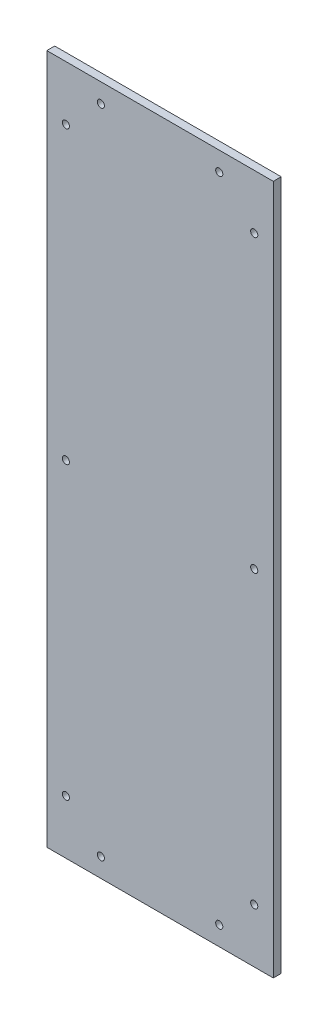
ISO-10303-21;
HEADER;
FILE_DESCRIPTION(('STEP AP214'),'2;1');
FILE_NAME('part.step','',(''),(''),'','','');
FILE_SCHEMA(('AUTOMOTIVE_DESIGN { 1 0 10303 214 1 1 1 1 }'));
ENDSEC;
DATA;
#1=APPLICATION_CONTEXT('core data for automotive mechanical design processes');
#2=APPLICATION_PROTOCOL_DEFINITION('international standard','automotive_design',2000,#1);
#3=PRODUCT_CONTEXT('',#1,'mechanical');
#4=PRODUCT('Part','Part','',(#3));
#5=PRODUCT_RELATED_PRODUCT_CATEGORY('part','',(#4));
#6=PRODUCT_DEFINITION_FORMATION('','',#4);
#7=PRODUCT_DEFINITION_CONTEXT('part definition',#1,'design');
#8=PRODUCT_DEFINITION('design','',#6,#7);
#9=PRODUCT_DEFINITION_SHAPE('','',#8);
#10=(LENGTH_UNIT() NAMED_UNIT(*) SI_UNIT(.MILLI.,.METRE.));
#11=(NAMED_UNIT(*) PLANE_ANGLE_UNIT() SI_UNIT($,.RADIAN.));
#12=(NAMED_UNIT(*) SI_UNIT($,.STERADIAN.) SOLID_ANGLE_UNIT());
#13=UNCERTAINTY_MEASURE_WITH_UNIT(LENGTH_MEASURE(1.E-05),#10,'distance_accuracy_value','');
#14=(GEOMETRIC_REPRESENTATION_CONTEXT(3) GLOBAL_UNCERTAINTY_ASSIGNED_CONTEXT((#13)) GLOBAL_UNIT_ASSIGNED_CONTEXT((#10,
#11,#12)) REPRESENTATION_CONTEXT('',''));
#15=CARTESIAN_POINT('',(0.,0.,0.));
#16=DIRECTION('',(0.,0.,1.));
#17=DIRECTION('',(1.,0.,0.));
#18=AXIS2_PLACEMENT_3D('',#15,#16,#17);
#19=CARTESIAN_POINT('',(0.,0.,4.7625));
#20=DIRECTION('',(0.,0.,1.));
#21=DIRECTION('',(1.,0.,0.));
#22=AXIS2_PLACEMENT_3D('',#19,#20,#21);
#23=PLANE('',#22);
#24=CARTESIAN_POINT('',(-92.2409193612177,-195.918834656084,4.7625));
#25=DIRECTION('',(0.,0.,-1.));
#26=DIRECTION('',(-1.,0.,0.));
#27=AXIS2_PLACEMENT_3D('',#24,#25,#26);
#28=CIRCLE('',#27,2.15265000000001);
#29=CARTESIAN_POINT('',(-94.3935693612177,-195.918834656084,4.7625));
#30=VERTEX_POINT('',#29);
#31=EDGE_CURVE('E165',#30,#30,#28,.T.);
#32=ORIENTED_EDGE('',*,*,#31,.T.);
#33=EDGE_LOOP('',(#32));
#34=FACE_BOUND('',#33,.T.);
#35=DIRECTION('',(0.,-1.,0.));
#36=VECTOR('',#35,1.);
#37=CARTESIAN_POINT('',(-124.816419361218,208.512665343915,4.7625));
#38=LINE('',#37,#36);
#39=CARTESIAN_POINT('',(-124.816419361218,208.512665343915,4.7625));
#40=VERTEX_POINT('',#39);
#41=CARTESIAN_POINT('',(-124.816419361218,-207.412334656085,4.7625));
#42=VERTEX_POINT('',#41);
#43=EDGE_CURVE('E86',#40,#42,#38,.T.);
#44=ORIENTED_EDGE('',*,*,#43,.T.);
#45=DIRECTION('',(1.,0.,0.));
#46=VECTOR('',#45,1.);
#47=CARTESIAN_POINT('',(-124.816419361218,-207.412334656085,4.7625));
#48=LINE('',#47,#46);
#49=CARTESIAN_POINT('',(11.7085806387823,-207.412334656085,4.7625));
#50=VERTEX_POINT('',#49);
#51=EDGE_CURVE('E81',#42,#50,#48,.T.);
#52=ORIENTED_EDGE('',*,*,#51,.T.);
#53=DIRECTION('',(0.,1.,0.));
#54=VECTOR('',#53,1.);
#55=CARTESIAN_POINT('',(11.7085806387823,208.512665343915,4.7625));
#56=LINE('',#55,#54);
#57=CARTESIAN_POINT('',(11.7085806387823,208.512665343915,4.7625));
#58=VERTEX_POINT('',#57);
#59=EDGE_CURVE('E84',#50,#58,#56,.T.);
#60=ORIENTED_EDGE('',*,*,#59,.T.);
#61=DIRECTION('',(-1.,0.,0.));
#62=VECTOR('',#61,1.);
#63=CARTESIAN_POINT('',(-124.816419361218,208.512665343915,4.7625));
#64=LINE('',#63,#62);
#65=EDGE_CURVE('E51',#58,#40,#64,.T.);
#66=ORIENTED_EDGE('',*,*,#65,.T.);
#67=EDGE_LOOP('',(#44,#52,#60,#66));
#68=FACE_BOUND('',#67,.T.);
#69=CARTESIAN_POINT('',(0.215080638782242,175.683165343915,4.7625));
#70=DIRECTION('',(0.,0.,-1.));
#71=DIRECTION('',(-1.,0.,0.));
#72=AXIS2_PLACEMENT_3D('',#69,#70,#71);
#73=CIRCLE('',#72,2.15265);
#74=CARTESIAN_POINT('',(-1.93756936121776,175.683165343915,4.7625));
#75=VERTEX_POINT('',#74);
#76=EDGE_CURVE('E101',#75,#75,#73,.T.);
#77=ORIENTED_EDGE('',*,*,#76,.T.);
#78=EDGE_LOOP('',(#77));
#79=FACE_BOUND('',#78,.T.);
#80=CARTESIAN_POINT('',(-113.322919361218,175.683165343915,4.7625));
#81=DIRECTION('',(0.,0.,-1.));
#82=DIRECTION('',(-1.,0.,0.));
#83=AXIS2_PLACEMENT_3D('',#80,#81,#82);
#84=CIRCLE('',#83,2.15265000000001);
#85=CARTESIAN_POINT('',(-115.475569361218,175.683165343915,4.7625));
#86=VERTEX_POINT('',#85);
#87=EDGE_CURVE('E117',#86,#86,#84,.T.);
#88=ORIENTED_EDGE('',*,*,#87,.T.);
#89=EDGE_LOOP('',(#88));
#90=FACE_BOUND('',#89,.T.);
#91=CARTESIAN_POINT('',(0.215080638782265,0.423165343915571,4.7625));
#92=DIRECTION('',(0.,0.,-1.));
#93=DIRECTION('',(-1.,0.,0.));
#94=AXIS2_PLACEMENT_3D('',#91,#92,#93);
#95=CIRCLE('',#94,2.15265);
#96=CARTESIAN_POINT('',(-1.93756936121773,0.423165343915571,4.7625));
#97=VERTEX_POINT('',#96);
#98=EDGE_CURVE('E123',#97,#97,#95,.T.);
#99=ORIENTED_EDGE('',*,*,#98,.T.);
#100=EDGE_LOOP('',(#99));
#101=FACE_BOUND('',#100,.T.);
#102=CARTESIAN_POINT('',(-20.8669193612177,197.019165343915,4.7625));
#103=DIRECTION('',(0.,0.,-1.));
#104=DIRECTION('',(-1.,0.,0.));
#105=AXIS2_PLACEMENT_3D('',#102,#103,#104);
#106=CIRCLE('',#105,2.15265);
#107=CARTESIAN_POINT('',(-23.0195693612177,197.019165343915,4.7625));
#108=VERTEX_POINT('',#107);
#109=EDGE_CURVE('E129',#108,#108,#106,.T.);
#110=ORIENTED_EDGE('',*,*,#109,.T.);
#111=EDGE_LOOP('',(#110));
#112=FACE_BOUND('',#111,.T.);
#113=CARTESIAN_POINT('',(-92.2409193612177,197.019165343915,4.7625));
#114=DIRECTION('',(0.,0.,-1.));
#115=DIRECTION('',(-1.,0.,0.));
#116=AXIS2_PLACEMENT_3D('',#113,#114,#115);
#117=CIRCLE('',#116,2.15265000000001);
#118=CARTESIAN_POINT('',(-94.3935693612177,197.019165343915,4.7625));
#119=VERTEX_POINT('',#118);
#120=EDGE_CURVE('E135',#119,#119,#117,.T.);
#121=ORIENTED_EDGE('',*,*,#120,.T.);
#122=EDGE_LOOP('',(#121));
#123=FACE_BOUND('',#122,.T.);
#124=CARTESIAN_POINT('',(-113.322919361218,0.42316534391551,4.7625));
#125=DIRECTION('',(0.,0.,-1.));
#126=DIRECTION('',(-1.,0.,0.));
#127=AXIS2_PLACEMENT_3D('',#124,#125,#126);
#128=CIRCLE('',#127,2.15265000000001);
#129=CARTESIAN_POINT('',(-115.475569361218,0.42316534391551,4.7625));
#130=VERTEX_POINT('',#129);
#131=EDGE_CURVE('E141',#130,#130,#128,.T.);
#132=ORIENTED_EDGE('',*,*,#131,.T.);
#133=EDGE_LOOP('',(#132));
#134=FACE_BOUND('',#133,.T.);
#135=CARTESIAN_POINT('',(0.215080638782289,-174.836834656084,4.7625));
#136=DIRECTION('',(0.,0.,-1.));
#137=DIRECTION('',(-1.,0.,0.));
#138=AXIS2_PLACEMENT_3D('',#135,#136,#137);
#139=CIRCLE('',#138,2.15265);
#140=CARTESIAN_POINT('',(-1.93756936121771,-174.836834656084,4.7625));
#141=VERTEX_POINT('',#140);
#142=EDGE_CURVE('E147',#141,#141,#139,.T.);
#143=ORIENTED_EDGE('',*,*,#142,.T.);
#144=EDGE_LOOP('',(#143));
#145=FACE_BOUND('',#144,.T.);
#146=CARTESIAN_POINT('',(-20.8669193612177,-195.918834656084,4.7625));
#147=DIRECTION('',(0.,0.,-1.));
#148=DIRECTION('',(-1.,0.,0.));
#149=AXIS2_PLACEMENT_3D('',#146,#147,#148);
#150=CIRCLE('',#149,2.15265);
#151=CARTESIAN_POINT('',(-23.0195693612177,-195.918834656084,4.7625));
#152=VERTEX_POINT('',#151);
#153=EDGE_CURVE('E153',#152,#152,#150,.T.);
#154=ORIENTED_EDGE('',*,*,#153,.T.);
#155=EDGE_LOOP('',(#154));
#156=FACE_BOUND('',#155,.T.);
#157=CARTESIAN_POINT('',(-113.322919361218,-174.836834656084,4.7625));
#158=DIRECTION('',(0.,0.,-1.));
#159=DIRECTION('',(-1.,0.,0.));
#160=AXIS2_PLACEMENT_3D('',#157,#158,#159);
#161=CIRCLE('',#160,2.15265000000001);
#162=CARTESIAN_POINT('',(-115.475569361218,-174.836834656084,4.7625));
#163=VERTEX_POINT('',#162);
#164=EDGE_CURVE('E159',#163,#163,#161,.T.);
#165=ORIENTED_EDGE('',*,*,#164,.T.);
#166=EDGE_LOOP('',(#165));
#167=FACE_BOUND('',#166,.T.);
#168=ADVANCED_FACE('F34',(#34,#68,#79,#90,#101,#112,#123,#134,#145,#156,#167),#23,.T.);
#169=CARTESIAN_POINT('',(-124.816419361218,208.512665343915,4.7625));
#170=DIRECTION('',(1.,0.,0.));
#171=DIRECTION('',(0.,1.,0.));
#172=AXIS2_PLACEMENT_3D('',#169,#170,#171);
#173=PLANE('',#172);
#174=DIRECTION('',(0.,-1.,0.));
#175=VECTOR('',#174,1.);
#176=CARTESIAN_POINT('',(-124.816419361218,208.512665343915,0.));
#177=LINE('',#176,#175);
#178=CARTESIAN_POINT('',(-124.816419361218,208.512665343915,0.));
#179=VERTEX_POINT('',#178);
#180=CARTESIAN_POINT('',(-124.816419361218,-207.412334656085,0.));
#181=VERTEX_POINT('',#180);
#182=EDGE_CURVE('E98',#179,#181,#177,.T.);
#183=ORIENTED_EDGE('',*,*,#182,.T.);
#184=DIRECTION('',(0.,0.,-1.));
#185=VECTOR('',#184,1.);
#186=CARTESIAN_POINT('',(-124.816419361218,-207.412334656085,4.7625));
#187=LINE('',#186,#185);
#188=EDGE_CURVE('E11',#42,#181,#187,.T.);
#189=ORIENTED_EDGE('',*,*,#188,.F.);
#190=ORIENTED_EDGE('',*,*,#43,.F.);
#191=DIRECTION('',(0.,0.,-1.));
#192=VECTOR('',#191,1.);
#193=CARTESIAN_POINT('',(-124.816419361218,208.512665343915,4.7625));
#194=LINE('',#193,#192);
#195=EDGE_CURVE('E94',#40,#179,#194,.T.);
#196=ORIENTED_EDGE('',*,*,#195,.T.);
#197=EDGE_LOOP('',(#183,#189,#190,#196));
#198=FACE_BOUND('',#197,.T.);
#199=ADVANCED_FACE('F36',(#198),#173,.F.);
#200=CARTESIAN_POINT('',(-124.816419361218,-207.412334656085,4.7625));
#201=DIRECTION('',(0.,1.,0.));
#202=DIRECTION('',(0.,0.,1.));
#203=AXIS2_PLACEMENT_3D('',#200,#201,#202);
#204=PLANE('',#203);
#205=DIRECTION('',(1.,0.,0.));
#206=VECTOR('',#205,1.);
#207=CARTESIAN_POINT('',(-124.816419361218,-207.412334656085,0.));
#208=LINE('',#207,#206);
#209=CARTESIAN_POINT('',(11.7085806387823,-207.412334656085,0.));
#210=VERTEX_POINT('',#209);
#211=EDGE_CURVE('E90',#181,#210,#208,.T.);
#212=ORIENTED_EDGE('',*,*,#211,.T.);
#213=DIRECTION('',(0.,0.,-1.));
#214=VECTOR('',#213,1.);
#215=CARTESIAN_POINT('',(11.7085806387823,-207.412334656085,4.7625));
#216=LINE('',#215,#214);
#217=EDGE_CURVE('E43',#50,#210,#216,.T.);
#218=ORIENTED_EDGE('',*,*,#217,.F.);
#219=ORIENTED_EDGE('',*,*,#51,.F.);
#220=ORIENTED_EDGE('',*,*,#188,.T.);
#221=EDGE_LOOP('',(#212,#218,#219,#220));
#222=FACE_BOUND('',#221,.T.);
#223=ADVANCED_FACE('F89',(#222),#204,.F.);
#224=CARTESIAN_POINT('',(11.7085806387823,208.512665343915,4.7625));
#225=DIRECTION('',(-1.,0.,0.));
#226=DIRECTION('',(0.,0.,1.));
#227=AXIS2_PLACEMENT_3D('',#224,#225,#226);
#228=PLANE('',#227);
#229=DIRECTION('',(0.,1.,0.));
#230=VECTOR('',#229,1.);
#231=CARTESIAN_POINT('',(11.7085806387823,208.512665343915,0.));
#232=LINE('',#231,#230);
#233=CARTESIAN_POINT('',(11.7085806387823,208.512665343915,0.));
#234=VERTEX_POINT('',#233);
#235=EDGE_CURVE('E68',#210,#234,#232,.T.);
#236=ORIENTED_EDGE('',*,*,#235,.T.);
#237=DIRECTION('',(0.,0.,-1.));
#238=VECTOR('',#237,1.);
#239=CARTESIAN_POINT('',(11.7085806387823,208.512665343915,4.7625));
#240=LINE('',#239,#238);
#241=EDGE_CURVE('E91',#58,#234,#240,.T.);
#242=ORIENTED_EDGE('',*,*,#241,.F.);
#243=ORIENTED_EDGE('',*,*,#59,.F.);
#244=ORIENTED_EDGE('',*,*,#217,.T.);
#245=EDGE_LOOP('',(#236,#242,#243,#244));
#246=FACE_BOUND('',#245,.T.);
#247=ADVANCED_FACE('F92',(#246),#228,.F.);
#248=CARTESIAN_POINT('',(-124.816419361218,208.512665343915,4.7625));
#249=DIRECTION('',(0.,-1.,0.));
#250=DIRECTION('',(0.,0.,-1.));
#251=AXIS2_PLACEMENT_3D('',#248,#249,#250);
#252=PLANE('',#251);
#253=DIRECTION('',(-1.,0.,0.));
#254=VECTOR('',#253,1.);
#255=CARTESIAN_POINT('',(-124.816419361218,208.512665343915,0.));
#256=LINE('',#255,#254);
#257=EDGE_CURVE('E74',#234,#179,#256,.T.);
#258=ORIENTED_EDGE('',*,*,#257,.T.);
#259=ORIENTED_EDGE('',*,*,#195,.F.);
#260=ORIENTED_EDGE('',*,*,#65,.F.);
#261=ORIENTED_EDGE('',*,*,#241,.T.);
#262=EDGE_LOOP('',(#258,#259,#260,#261));
#263=FACE_BOUND('',#262,.T.);
#264=ADVANCED_FACE('F106',(#263),#252,.F.);
#265=CARTESIAN_POINT('',(0.,0.,0.));
#266=DIRECTION('',(0.,0.,1.));
#267=DIRECTION('',(1.,0.,0.));
#268=AXIS2_PLACEMENT_3D('',#265,#266,#267);
#269=PLANE('',#268);
#270=CARTESIAN_POINT('',(-92.2409193612177,-195.918834656084,0.));
#271=DIRECTION('',(0.,0.,-1.));
#272=DIRECTION('',(-1.,0.,0.));
#273=AXIS2_PLACEMENT_3D('',#270,#271,#272);
#274=CIRCLE('',#273,2.15265000000001);
#275=CARTESIAN_POINT('',(-94.3935693612177,-195.918834656084,0.));
#276=VERTEX_POINT('',#275);
#277=EDGE_CURVE('E168',#276,#276,#274,.T.);
#278=ORIENTED_EDGE('',*,*,#277,.F.);
#279=EDGE_LOOP('',(#278));
#280=FACE_BOUND('',#279,.T.);
#281=CARTESIAN_POINT('',(-113.322919361218,-174.836834656084,0.));
#282=DIRECTION('',(0.,0.,-1.));
#283=DIRECTION('',(-1.,0.,0.));
#284=AXIS2_PLACEMENT_3D('',#281,#282,#283);
#285=CIRCLE('',#284,2.15265000000001);
#286=CARTESIAN_POINT('',(-115.475569361218,-174.836834656084,0.));
#287=VERTEX_POINT('',#286);
#288=EDGE_CURVE('E162',#287,#287,#285,.T.);
#289=ORIENTED_EDGE('',*,*,#288,.F.);
#290=EDGE_LOOP('',(#289));
#291=FACE_BOUND('',#290,.T.);
#292=CARTESIAN_POINT('',(-20.8669193612177,-195.918834656084,0.));
#293=DIRECTION('',(0.,0.,-1.));
#294=DIRECTION('',(-1.,0.,0.));
#295=AXIS2_PLACEMENT_3D('',#292,#293,#294);
#296=CIRCLE('',#295,2.15265);
#297=CARTESIAN_POINT('',(-23.0195693612177,-195.918834656084,0.));
#298=VERTEX_POINT('',#297);
#299=EDGE_CURVE('E156',#298,#298,#296,.T.);
#300=ORIENTED_EDGE('',*,*,#299,.F.);
#301=EDGE_LOOP('',(#300));
#302=FACE_BOUND('',#301,.T.);
#303=CARTESIAN_POINT('',(0.215080638782289,-174.836834656084,0.));
#304=DIRECTION('',(0.,0.,-1.));
#305=DIRECTION('',(-1.,0.,0.));
#306=AXIS2_PLACEMENT_3D('',#303,#304,#305);
#307=CIRCLE('',#306,2.15265);
#308=CARTESIAN_POINT('',(-1.93756936121771,-174.836834656084,0.));
#309=VERTEX_POINT('',#308);
#310=EDGE_CURVE('E150',#309,#309,#307,.T.);
#311=ORIENTED_EDGE('',*,*,#310,.F.);
#312=EDGE_LOOP('',(#311));
#313=FACE_BOUND('',#312,.T.);
#314=CARTESIAN_POINT('',(-113.322919361218,0.42316534391551,0.));
#315=DIRECTION('',(0.,0.,-1.));
#316=DIRECTION('',(-1.,0.,0.));
#317=AXIS2_PLACEMENT_3D('',#314,#315,#316);
#318=CIRCLE('',#317,2.15265000000001);
#319=CARTESIAN_POINT('',(-115.475569361218,0.42316534391551,0.));
#320=VERTEX_POINT('',#319);
#321=EDGE_CURVE('E144',#320,#320,#318,.T.);
#322=ORIENTED_EDGE('',*,*,#321,.F.);
#323=EDGE_LOOP('',(#322));
#324=FACE_BOUND('',#323,.T.);
#325=CARTESIAN_POINT('',(-92.2409193612177,197.019165343915,0.));
#326=DIRECTION('',(0.,0.,-1.));
#327=DIRECTION('',(-1.,0.,0.));
#328=AXIS2_PLACEMENT_3D('',#325,#326,#327);
#329=CIRCLE('',#328,2.15265000000001);
#330=CARTESIAN_POINT('',(-94.3935693612177,197.019165343915,0.));
#331=VERTEX_POINT('',#330);
#332=EDGE_CURVE('E138',#331,#331,#329,.T.);
#333=ORIENTED_EDGE('',*,*,#332,.F.);
#334=EDGE_LOOP('',(#333));
#335=FACE_BOUND('',#334,.T.);
#336=CARTESIAN_POINT('',(-20.8669193612177,197.019165343915,0.));
#337=DIRECTION('',(0.,0.,-1.));
#338=DIRECTION('',(-1.,0.,0.));
#339=AXIS2_PLACEMENT_3D('',#336,#337,#338);
#340=CIRCLE('',#339,2.15265);
#341=CARTESIAN_POINT('',(-23.0195693612177,197.019165343915,0.));
#342=VERTEX_POINT('',#341);
#343=EDGE_CURVE('E132',#342,#342,#340,.T.);
#344=ORIENTED_EDGE('',*,*,#343,.F.);
#345=EDGE_LOOP('',(#344));
#346=FACE_BOUND('',#345,.T.);
#347=CARTESIAN_POINT('',(0.215080638782265,0.423165343915571,0.));
#348=DIRECTION('',(0.,0.,-1.));
#349=DIRECTION('',(-1.,0.,0.));
#350=AXIS2_PLACEMENT_3D('',#347,#348,#349);
#351=CIRCLE('',#350,2.15265);
#352=CARTESIAN_POINT('',(-1.93756936121773,0.423165343915571,0.));
#353=VERTEX_POINT('',#352);
#354=EDGE_CURVE('E126',#353,#353,#351,.T.);
#355=ORIENTED_EDGE('',*,*,#354,.F.);
#356=EDGE_LOOP('',(#355));
#357=FACE_BOUND('',#356,.T.);
#358=CARTESIAN_POINT('',(-113.322919361218,175.683165343915,0.));
#359=DIRECTION('',(0.,0.,-1.));
#360=DIRECTION('',(-1.,0.,0.));
#361=AXIS2_PLACEMENT_3D('',#358,#359,#360);
#362=CIRCLE('',#361,2.15265000000001);
#363=CARTESIAN_POINT('',(-115.475569361218,175.683165343915,0.));
#364=VERTEX_POINT('',#363);
#365=EDGE_CURVE('E120',#364,#364,#362,.T.);
#366=ORIENTED_EDGE('',*,*,#365,.F.);
#367=EDGE_LOOP('',(#366));
#368=FACE_BOUND('',#367,.T.);
#369=CARTESIAN_POINT('',(0.215080638782242,175.683165343915,0.));
#370=DIRECTION('',(0.,0.,-1.));
#371=DIRECTION('',(-1.,0.,0.));
#372=AXIS2_PLACEMENT_3D('',#369,#370,#371);
#373=CIRCLE('',#372,2.15265);
#374=CARTESIAN_POINT('',(-1.93756936121776,175.683165343915,0.));
#375=VERTEX_POINT('',#374);
#376=EDGE_CURVE('E114',#375,#375,#373,.T.);
#377=ORIENTED_EDGE('',*,*,#376,.F.);
#378=EDGE_LOOP('',(#377));
#379=FACE_BOUND('',#378,.T.);
#380=ORIENTED_EDGE('',*,*,#182,.F.);
#381=ORIENTED_EDGE('',*,*,#257,.F.);
#382=ORIENTED_EDGE('',*,*,#235,.F.);
#383=ORIENTED_EDGE('',*,*,#211,.F.);
#384=EDGE_LOOP('',(#380,#381,#382,#383));
#385=FACE_BOUND('',#384,.T.);
#386=ADVANCED_FACE('F109',(#280,#291,#302,#313,#324,#335,#346,#357,#368,#379,#385),#269,.F.);
#387=CARTESIAN_POINT('',(0.215080638782242,175.683165343915,0.));
#388=DIRECTION('',(0.,0.,-1.));
#389=DIRECTION('',(-1.,0.,0.));
#390=AXIS2_PLACEMENT_3D('',#387,#388,#389);
#391=CYLINDRICAL_SURFACE('',#390,2.15265);
#392=ORIENTED_EDGE('',*,*,#76,.F.);
#393=EDGE_LOOP('',(#392));
#394=FACE_BOUND('',#393,.T.);
#395=ORIENTED_EDGE('',*,*,#376,.T.);
#396=EDGE_LOOP('',(#395));
#397=FACE_BOUND('',#396,.T.);
#398=ADVANCED_FACE('F176',(#394,#397),#391,.F.);
#399=CARTESIAN_POINT('',(-113.322919361218,175.683165343915,0.));
#400=DIRECTION('',(0.,0.,-1.));
#401=DIRECTION('',(-1.,0.,0.));
#402=AXIS2_PLACEMENT_3D('',#399,#400,#401);
#403=CYLINDRICAL_SURFACE('',#402,2.15265000000001);
#404=ORIENTED_EDGE('',*,*,#87,.F.);
#405=EDGE_LOOP('',(#404));
#406=FACE_BOUND('',#405,.T.);
#407=ORIENTED_EDGE('',*,*,#365,.T.);
#408=EDGE_LOOP('',(#407));
#409=FACE_BOUND('',#408,.T.);
#410=ADVANCED_FACE('F197',(#406,#409),#403,.F.);
#411=CARTESIAN_POINT('',(0.215080638782265,0.423165343915571,0.));
#412=DIRECTION('',(0.,0.,-1.));
#413=DIRECTION('',(-1.,0.,0.));
#414=AXIS2_PLACEMENT_3D('',#411,#412,#413);
#415=CYLINDRICAL_SURFACE('',#414,2.15265);
#416=ORIENTED_EDGE('',*,*,#98,.F.);
#417=EDGE_LOOP('',(#416));
#418=FACE_BOUND('',#417,.T.);
#419=ORIENTED_EDGE('',*,*,#354,.T.);
#420=EDGE_LOOP('',(#419));
#421=FACE_BOUND('',#420,.T.);
#422=ADVANCED_FACE('F203',(#418,#421),#415,.F.);
#423=CARTESIAN_POINT('',(-20.8669193612177,197.019165343915,0.));
#424=DIRECTION('',(0.,0.,-1.));
#425=DIRECTION('',(-1.,0.,0.));
#426=AXIS2_PLACEMENT_3D('',#423,#424,#425);
#427=CYLINDRICAL_SURFACE('',#426,2.15265);
#428=ORIENTED_EDGE('',*,*,#109,.F.);
#429=EDGE_LOOP('',(#428));
#430=FACE_BOUND('',#429,.T.);
#431=ORIENTED_EDGE('',*,*,#343,.T.);
#432=EDGE_LOOP('',(#431));
#433=FACE_BOUND('',#432,.T.);
#434=ADVANCED_FACE('F279',(#430,#433),#427,.F.);
#435=CARTESIAN_POINT('',(-92.2409193612177,197.019165343915,0.));
#436=DIRECTION('',(0.,0.,-1.));
#437=DIRECTION('',(-1.,0.,0.));
#438=AXIS2_PLACEMENT_3D('',#435,#436,#437);
#439=CYLINDRICAL_SURFACE('',#438,2.15265000000001);
#440=ORIENTED_EDGE('',*,*,#120,.F.);
#441=EDGE_LOOP('',(#440));
#442=FACE_BOUND('',#441,.T.);
#443=ORIENTED_EDGE('',*,*,#332,.T.);
#444=EDGE_LOOP('',(#443));
#445=FACE_BOUND('',#444,.T.);
#446=ADVANCED_FACE('F288',(#442,#445),#439,.F.);
#447=CARTESIAN_POINT('',(-113.322919361218,0.42316534391551,0.));
#448=DIRECTION('',(0.,0.,-1.));
#449=DIRECTION('',(-1.,0.,0.));
#450=AXIS2_PLACEMENT_3D('',#447,#448,#449);
#451=CYLINDRICAL_SURFACE('',#450,2.15265000000001);
#452=ORIENTED_EDGE('',*,*,#131,.F.);
#453=EDGE_LOOP('',(#452));
#454=FACE_BOUND('',#453,.T.);
#455=ORIENTED_EDGE('',*,*,#321,.T.);
#456=EDGE_LOOP('',(#455));
#457=FACE_BOUND('',#456,.T.);
#458=ADVANCED_FACE('F297',(#454,#457),#451,.F.);
#459=CARTESIAN_POINT('',(0.215080638782289,-174.836834656084,0.));
#460=DIRECTION('',(0.,0.,-1.));
#461=DIRECTION('',(-1.,0.,0.));
#462=AXIS2_PLACEMENT_3D('',#459,#460,#461);
#463=CYLINDRICAL_SURFACE('',#462,2.15265);
#464=ORIENTED_EDGE('',*,*,#142,.F.);
#465=EDGE_LOOP('',(#464));
#466=FACE_BOUND('',#465,.T.);
#467=ORIENTED_EDGE('',*,*,#310,.T.);
#468=EDGE_LOOP('',(#467));
#469=FACE_BOUND('',#468,.T.);
#470=ADVANCED_FACE('F306',(#466,#469),#463,.F.);
#471=CARTESIAN_POINT('',(-20.8669193612177,-195.918834656084,0.));
#472=DIRECTION('',(0.,0.,-1.));
#473=DIRECTION('',(-1.,0.,0.));
#474=AXIS2_PLACEMENT_3D('',#471,#472,#473);
#475=CYLINDRICAL_SURFACE('',#474,2.15265);
#476=ORIENTED_EDGE('',*,*,#153,.F.);
#477=EDGE_LOOP('',(#476));
#478=FACE_BOUND('',#477,.T.);
#479=ORIENTED_EDGE('',*,*,#299,.T.);
#480=EDGE_LOOP('',(#479));
#481=FACE_BOUND('',#480,.T.);
#482=ADVANCED_FACE('F315',(#478,#481),#475,.F.);
#483=CARTESIAN_POINT('',(-113.322919361218,-174.836834656084,0.));
#484=DIRECTION('',(0.,0.,-1.));
#485=DIRECTION('',(-1.,0.,0.));
#486=AXIS2_PLACEMENT_3D('',#483,#484,#485);
#487=CYLINDRICAL_SURFACE('',#486,2.15265000000001);
#488=ORIENTED_EDGE('',*,*,#164,.F.);
#489=EDGE_LOOP('',(#488));
#490=FACE_BOUND('',#489,.T.);
#491=ORIENTED_EDGE('',*,*,#288,.T.);
#492=EDGE_LOOP('',(#491));
#493=FACE_BOUND('',#492,.T.);
#494=ADVANCED_FACE('F324',(#490,#493),#487,.F.);
#495=CARTESIAN_POINT('',(-92.2409193612177,-195.918834656084,0.));
#496=DIRECTION('',(0.,0.,-1.));
#497=DIRECTION('',(-1.,0.,0.));
#498=AXIS2_PLACEMENT_3D('',#495,#496,#497);
#499=CYLINDRICAL_SURFACE('',#498,2.15265000000001);
#500=ORIENTED_EDGE('',*,*,#31,.F.);
#501=EDGE_LOOP('',(#500));
#502=FACE_BOUND('',#501,.T.);
#503=ORIENTED_EDGE('',*,*,#277,.T.);
#504=EDGE_LOOP('',(#503));
#505=FACE_BOUND('',#504,.T.);
#506=ADVANCED_FACE('F172',(#502,#505),#499,.F.);
#507=CLOSED_SHELL('',(#168,#199,#223,#247,#264,#386,#398,#410,#422,#434,#446,#458,#470,#482,
#494,#506));
#508=MANIFOLD_SOLID_BREP('B2',#507);
#509=ADVANCED_BREP_SHAPE_REPRESENTATION('',(#18,#508),#14);
#510=SHAPE_DEFINITION_REPRESENTATION(#9,#509);
ENDSEC;
END-ISO-10303-21;
